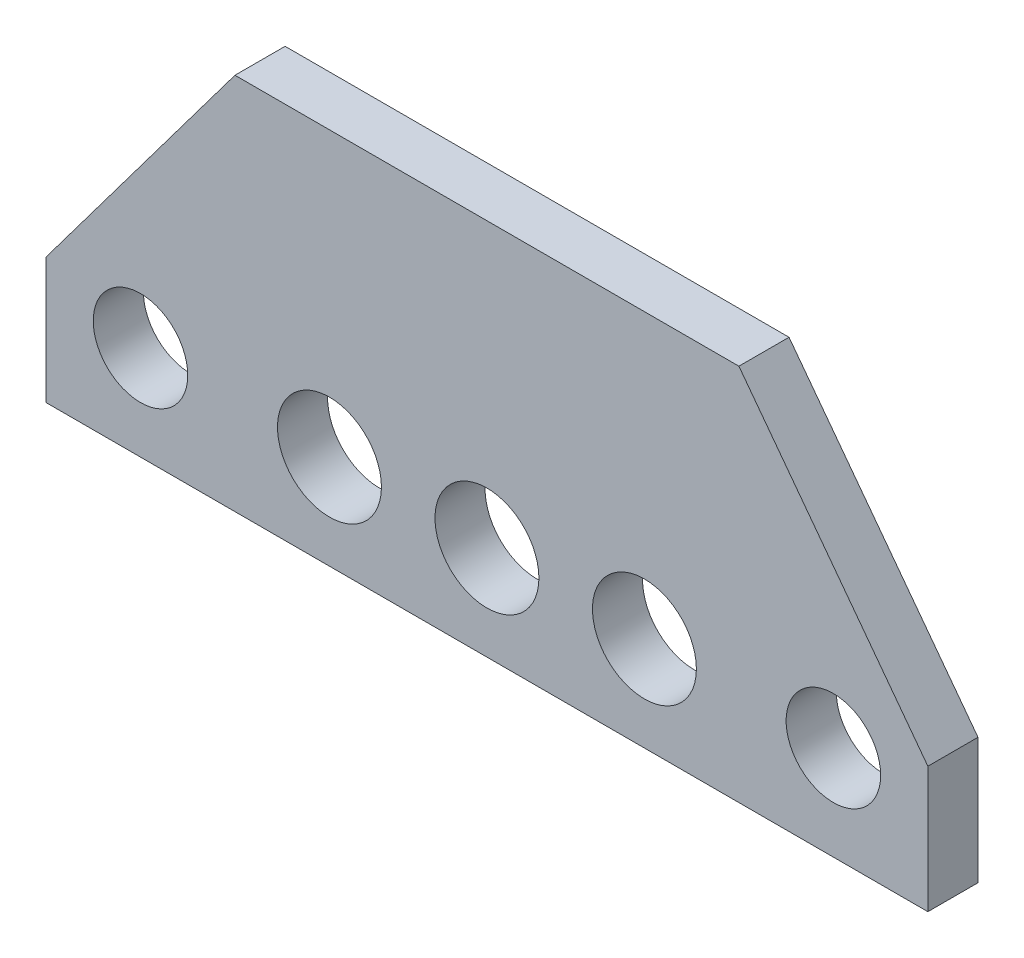
ISO-10303-21;
HEADER;
FILE_DESCRIPTION(('STEP AP214'),'2;1');
FILE_NAME('part.step','',(''),(''),'','','');
FILE_SCHEMA(('AUTOMOTIVE_DESIGN { 1 0 10303 214 1 1 1 1 }'));
ENDSEC;
DATA;
#1=APPLICATION_CONTEXT('core data for automotive mechanical design processes');
#2=APPLICATION_PROTOCOL_DEFINITION('international standard','automotive_design',2000,#1);
#3=PRODUCT_CONTEXT('',#1,'mechanical');
#4=PRODUCT('Part','Part','',(#3));
#5=PRODUCT_RELATED_PRODUCT_CATEGORY('part','',(#4));
#6=PRODUCT_DEFINITION_FORMATION('','',#4);
#7=PRODUCT_DEFINITION_CONTEXT('part definition',#1,'design');
#8=PRODUCT_DEFINITION('design','',#6,#7);
#9=PRODUCT_DEFINITION_SHAPE('','',#8);
#10=(LENGTH_UNIT() NAMED_UNIT(*) SI_UNIT(.MILLI.,.METRE.));
#11=(NAMED_UNIT(*) PLANE_ANGLE_UNIT() SI_UNIT($,.RADIAN.));
#12=(NAMED_UNIT(*) SI_UNIT($,.STERADIAN.) SOLID_ANGLE_UNIT());
#13=UNCERTAINTY_MEASURE_WITH_UNIT(LENGTH_MEASURE(1.E-05),#10,'distance_accuracy_value','');
#14=(GEOMETRIC_REPRESENTATION_CONTEXT(3) GLOBAL_UNCERTAINTY_ASSIGNED_CONTEXT((#13)) GLOBAL_UNIT_ASSIGNED_CONTEXT((#10,
#11,#12)) REPRESENTATION_CONTEXT('',''));
#15=CARTESIAN_POINT('',(0.,0.,0.));
#16=DIRECTION('',(0.,0.,1.));
#17=DIRECTION('',(1.,0.,0.));
#18=AXIS2_PLACEMENT_3D('',#15,#16,#17);
#19=CARTESIAN_POINT('',(0.,0.,-1.59143954));
#20=DIRECTION('',(0.,1.,0.));
#21=DIRECTION('',(1.,0.,0.));
#22=AXIS2_PLACEMENT_3D('',#19,#20,#21);
#23=PLANE('',#22);
#24=DIRECTION('',(1.,0.,0.));
#25=VECTOR('',#24,1.);
#26=CARTESIAN_POINT('',(0.,0.,-1.59143954));
#27=LINE('',#26,#25);
#28=CARTESIAN_POINT('',(0.,0.,-1.59143954));
#29=VERTEX_POINT('',#28);
#30=CARTESIAN_POINT('',(28.,0.,-1.59143954));
#31=VERTEX_POINT('',#30);
#32=EDGE_CURVE('E12',#29,#31,#27,.T.);
#33=ORIENTED_EDGE('',*,*,#32,.T.);
#34=DIRECTION('',(0.,0.,1.));
#35=VECTOR('',#34,1.);
#36=CARTESIAN_POINT('',(28.,0.,-1.59143954));
#37=LINE('',#36,#35);
#38=CARTESIAN_POINT('',(28.,0.,0.));
#39=VERTEX_POINT('',#38);
#40=EDGE_CURVE('E26',#31,#39,#37,.T.);
#41=ORIENTED_EDGE('',*,*,#40,.T.);
#42=DIRECTION('',(1.,0.,0.));
#43=VECTOR('',#42,1.);
#44=CARTESIAN_POINT('',(0.,0.,0.));
#45=LINE('',#44,#43);
#46=CARTESIAN_POINT('',(0.,0.,0.));
#47=VERTEX_POINT('',#46);
#48=EDGE_CURVE('E169',#47,#39,#45,.T.);
#49=ORIENTED_EDGE('',*,*,#48,.F.);
#50=DIRECTION('',(0.,0.,1.));
#51=VECTOR('',#50,1.);
#52=CARTESIAN_POINT('',(0.,0.,-1.59143954));
#53=LINE('',#52,#51);
#54=EDGE_CURVE('E38',#29,#47,#53,.T.);
#55=ORIENTED_EDGE('',*,*,#54,.F.);
#56=EDGE_LOOP('',(#33,#41,#49,#55));
#57=FACE_BOUND('',#56,.T.);
#58=ADVANCED_FACE('F19',(#57),#23,.F.);
#59=CARTESIAN_POINT('',(28.,0.,-1.59143954));
#60=DIRECTION('',(-1.,0.,0.));
#61=DIRECTION('',(0.,1.,0.));
#62=AXIS2_PLACEMENT_3D('',#59,#60,#61);
#63=PLANE('',#62);
#64=DIRECTION('',(0.,1.,0.));
#65=VECTOR('',#64,1.);
#66=CARTESIAN_POINT('',(28.,0.,-1.59143954));
#67=LINE('',#66,#65);
#68=CARTESIAN_POINT('',(28.,4.,-1.59143954));
#69=VERTEX_POINT('',#68);
#70=EDGE_CURVE('E161',#31,#69,#67,.T.);
#71=ORIENTED_EDGE('',*,*,#70,.T.);
#72=DIRECTION('',(0.,0.,1.));
#73=VECTOR('',#72,1.);
#74=CARTESIAN_POINT('',(28.,4.,-1.59143954));
#75=LINE('',#74,#73);
#76=CARTESIAN_POINT('',(28.,4.,0.));
#77=VERTEX_POINT('',#76);
#78=EDGE_CURVE('E166',#69,#77,#75,.T.);
#79=ORIENTED_EDGE('',*,*,#78,.T.);
#80=DIRECTION('',(0.,1.,0.));
#81=VECTOR('',#80,1.);
#82=CARTESIAN_POINT('',(28.,0.,0.));
#83=LINE('',#82,#81);
#84=EDGE_CURVE('E172',#39,#77,#83,.T.);
#85=ORIENTED_EDGE('',*,*,#84,.F.);
#86=ORIENTED_EDGE('',*,*,#40,.F.);
#87=EDGE_LOOP('',(#71,#79,#85,#86));
#88=FACE_BOUND('',#87,.T.);
#89=ADVANCED_FACE('F173',(#88),#63,.F.);
#90=CARTESIAN_POINT('',(28.,4.,-1.59143954));
#91=DIRECTION('',(-0.8,-0.6,0.));
#92=DIRECTION('',(-0.6,0.8,0.));
#93=AXIS2_PLACEMENT_3D('',#90,#91,#92);
#94=PLANE('',#93);
#95=DIRECTION('',(-0.6,0.8,0.));
#96=VECTOR('',#95,1.);
#97=CARTESIAN_POINT('',(28.,4.,-1.59143954));
#98=LINE('',#97,#96);
#99=CARTESIAN_POINT('',(22.,12.,-1.59143954));
#100=VERTEX_POINT('',#99);
#101=EDGE_CURVE('E176',#69,#100,#98,.T.);
#102=ORIENTED_EDGE('',*,*,#101,.T.);
#103=DIRECTION('',(0.,0.,1.));
#104=VECTOR('',#103,1.);
#105=CARTESIAN_POINT('',(22.,12.,-1.59143954));
#106=LINE('',#105,#104);
#107=CARTESIAN_POINT('',(22.,12.,0.));
#108=VERTEX_POINT('',#107);
#109=EDGE_CURVE('E178',#100,#108,#106,.T.);
#110=ORIENTED_EDGE('',*,*,#109,.T.);
#111=DIRECTION('',(-0.6,0.8,0.));
#112=VECTOR('',#111,1.);
#113=CARTESIAN_POINT('',(28.,4.,0.));
#114=LINE('',#113,#112);
#115=EDGE_CURVE('E183',#77,#108,#114,.T.);
#116=ORIENTED_EDGE('',*,*,#115,.F.);
#117=ORIENTED_EDGE('',*,*,#78,.F.);
#118=EDGE_LOOP('',(#102,#110,#116,#117));
#119=FACE_BOUND('',#118,.T.);
#120=ADVANCED_FACE('F199',(#119),#94,.F.);
#121=CARTESIAN_POINT('',(22.,12.,-1.59143954));
#122=DIRECTION('',(0.,-1.,0.));
#123=DIRECTION('',(-1.,0.,0.));
#124=AXIS2_PLACEMENT_3D('',#121,#122,#123);
#125=PLANE('',#124);
#126=DIRECTION('',(-1.,0.,0.));
#127=VECTOR('',#126,1.);
#128=CARTESIAN_POINT('',(22.,12.,-1.59143954));
#129=LINE('',#128,#127);
#130=CARTESIAN_POINT('',(6.,12.,-1.59143954));
#131=VERTEX_POINT('',#130);
#132=EDGE_CURVE('E185',#100,#131,#129,.T.);
#133=ORIENTED_EDGE('',*,*,#132,.T.);
#134=DIRECTION('',(0.,0.,1.));
#135=VECTOR('',#134,1.);
#136=CARTESIAN_POINT('',(6.,12.,-1.59143954));
#137=LINE('',#136,#135);
#138=CARTESIAN_POINT('',(6.,12.,0.));
#139=VERTEX_POINT('',#138);
#140=EDGE_CURVE('E187',#131,#139,#137,.T.);
#141=ORIENTED_EDGE('',*,*,#140,.T.);
#142=DIRECTION('',(-1.,0.,0.));
#143=VECTOR('',#142,1.);
#144=CARTESIAN_POINT('',(22.,12.,0.));
#145=LINE('',#144,#143);
#146=EDGE_CURVE('E154',#108,#139,#145,.T.);
#147=ORIENTED_EDGE('',*,*,#146,.F.);
#148=ORIENTED_EDGE('',*,*,#109,.F.);
#149=EDGE_LOOP('',(#133,#141,#147,#148));
#150=FACE_BOUND('',#149,.T.);
#151=ADVANCED_FACE('F194',(#150),#125,.F.);
#152=CARTESIAN_POINT('',(6.,12.,-1.59143954));
#153=DIRECTION('',(0.8,-0.6,0.));
#154=DIRECTION('',(-0.6,-0.8,0.));
#155=AXIS2_PLACEMENT_3D('',#152,#153,#154);
#156=PLANE('',#155);
#157=DIRECTION('',(-0.6,-0.8,0.));
#158=VECTOR('',#157,1.);
#159=CARTESIAN_POINT('',(6.,12.,-1.59143954));
#160=LINE('',#159,#158);
#161=CARTESIAN_POINT('',(0.,4.,-1.59143954));
#162=VERTEX_POINT('',#161);
#163=EDGE_CURVE('E149',#131,#162,#160,.T.);
#164=ORIENTED_EDGE('',*,*,#163,.T.);
#165=DIRECTION('',(0.,0.,1.));
#166=VECTOR('',#165,1.);
#167=CARTESIAN_POINT('',(0.,4.,-1.59143954));
#168=LINE('',#167,#166);
#169=CARTESIAN_POINT('',(0.,4.,0.));
#170=VERTEX_POINT('',#169);
#171=EDGE_CURVE('E147',#162,#170,#168,.T.);
#172=ORIENTED_EDGE('',*,*,#171,.T.);
#173=DIRECTION('',(-0.6,-0.8,0.));
#174=VECTOR('',#173,1.);
#175=CARTESIAN_POINT('',(6.,12.,0.));
#176=LINE('',#175,#174);
#177=EDGE_CURVE('E145',#139,#170,#176,.T.);
#178=ORIENTED_EDGE('',*,*,#177,.F.);
#179=ORIENTED_EDGE('',*,*,#140,.F.);
#180=EDGE_LOOP('',(#164,#172,#178,#179));
#181=FACE_BOUND('',#180,.T.);
#182=ADVANCED_FACE('F204',(#181),#156,.F.);
#183=CARTESIAN_POINT('',(0.,4.,-1.59143954));
#184=DIRECTION('',(1.,0.,0.));
#185=DIRECTION('',(0.,-1.,0.));
#186=AXIS2_PLACEMENT_3D('',#183,#184,#185);
#187=PLANE('',#186);
#188=DIRECTION('',(0.,-1.,0.));
#189=VECTOR('',#188,1.);
#190=CARTESIAN_POINT('',(0.,4.,-1.59143954));
#191=LINE('',#190,#189);
#192=EDGE_CURVE('E142',#162,#29,#191,.T.);
#193=ORIENTED_EDGE('',*,*,#192,.T.);
#194=ORIENTED_EDGE('',*,*,#54,.T.);
#195=DIRECTION('',(0.,-1.,0.));
#196=VECTOR('',#195,1.);
#197=CARTESIAN_POINT('',(0.,4.,0.));
#198=LINE('',#197,#196);
#199=EDGE_CURVE('E139',#170,#47,#198,.T.);
#200=ORIENTED_EDGE('',*,*,#199,.F.);
#201=ORIENTED_EDGE('',*,*,#171,.F.);
#202=EDGE_LOOP('',(#193,#194,#200,#201));
#203=FACE_BOUND('',#202,.T.);
#204=ADVANCED_FACE('F207',(#203),#187,.F.);
#205=CARTESIAN_POINT('',(8.99999978,2.99999908,-1.59143954));
#206=DIRECTION('',(0.,0.,-1.));
#207=DIRECTION('',(1.,0.,0.));
#208=AXIS2_PLACEMENT_3D('',#205,#206,#207);
#209=CYLINDRICAL_SURFACE('',#208,1.64999924);
#210=DIRECTION('',(0.,0.,1.));
#211=VECTOR('',#210,1.);
#212=CARTESIAN_POINT('',(10.64999902,2.99999908,-1.59143954));
#213=LINE('',#212,#211);
#214=CARTESIAN_POINT('',(10.64999902,2.99999908,-1.59143954));
#215=VERTEX_POINT('',#214);
#216=CARTESIAN_POINT('',(10.64999902,2.99999908,0.));
#217=VERTEX_POINT('',#216);
#218=EDGE_CURVE('E137',#215,#217,#213,.T.);
#219=ORIENTED_EDGE('',*,*,#218,.T.);
#220=CARTESIAN_POINT('',(8.99999978,2.99999908,0.));
#221=DIRECTION('',(0.,0.,1.));
#222=DIRECTION('',(1.,0.,0.));
#223=AXIS2_PLACEMENT_3D('',#220,#221,#222);
#224=CIRCLE('',#223,1.64999924);
#225=EDGE_CURVE('E134',#217,#217,#224,.T.);
#226=ORIENTED_EDGE('',*,*,#225,.T.);
#227=ORIENTED_EDGE('',*,*,#218,.F.);
#228=CARTESIAN_POINT('',(8.99999978,2.99999908,-1.59143954));
#229=DIRECTION('',(0.,0.,1.));
#230=DIRECTION('',(1.,0.,0.));
#231=AXIS2_PLACEMENT_3D('',#228,#229,#230);
#232=CIRCLE('',#231,1.64999924);
#233=EDGE_CURVE('E132',#215,#215,#232,.T.);
#234=ORIENTED_EDGE('',*,*,#233,.F.);
#235=EDGE_LOOP('',(#219,#226,#227,#234));
#236=FACE_BOUND('',#235,.T.);
#237=ADVANCED_FACE('F209',(#236),#209,.F.);
#238=CARTESIAN_POINT('',(2.99999908,2.99999908,-1.59143954));
#239=DIRECTION('',(0.,0.,-1.));
#240=DIRECTION('',(1.,0.,0.));
#241=AXIS2_PLACEMENT_3D('',#238,#239,#240);
#242=CYLINDRICAL_SURFACE('',#241,1.49999954);
#243=DIRECTION('',(0.,0.,1.));
#244=VECTOR('',#243,1.);
#245=CARTESIAN_POINT('',(4.49999862,2.99999908,-1.59143954));
#246=LINE('',#245,#244);
#247=CARTESIAN_POINT('',(4.49999862,2.99999908,-1.59143954));
#248=VERTEX_POINT('',#247);
#249=CARTESIAN_POINT('',(4.49999862,2.99999908,0.));
#250=VERTEX_POINT('',#249);
#251=EDGE_CURVE('E130',#248,#250,#246,.T.);
#252=ORIENTED_EDGE('',*,*,#251,.T.);
#253=CARTESIAN_POINT('',(2.99999908,2.99999908,0.));
#254=DIRECTION('',(0.,0.,1.));
#255=DIRECTION('',(1.,0.,0.));
#256=AXIS2_PLACEMENT_3D('',#253,#254,#255);
#257=CIRCLE('',#256,1.49999954);
#258=EDGE_CURVE('E127',#250,#250,#257,.T.);
#259=ORIENTED_EDGE('',*,*,#258,.T.);
#260=ORIENTED_EDGE('',*,*,#251,.F.);
#261=CARTESIAN_POINT('',(2.99999908,2.99999908,-1.59143954));
#262=DIRECTION('',(0.,0.,1.));
#263=DIRECTION('',(1.,0.,0.));
#264=AXIS2_PLACEMENT_3D('',#261,#262,#263);
#265=CIRCLE('',#264,1.49999954);
#266=EDGE_CURVE('E125',#248,#248,#265,.T.);
#267=ORIENTED_EDGE('',*,*,#266,.F.);
#268=EDGE_LOOP('',(#252,#259,#260,#267));
#269=FACE_BOUND('',#268,.T.);
#270=ADVANCED_FACE('F216',(#269),#242,.F.);
#271=CARTESIAN_POINT('',(13.99999994,2.99999908,-1.59143954));
#272=DIRECTION('',(0.,0.,-1.));
#273=DIRECTION('',(1.,0.,0.));
#274=AXIS2_PLACEMENT_3D('',#271,#272,#273);
#275=CYLINDRICAL_SURFACE('',#274,1.64999924);
#276=DIRECTION('',(0.,0.,1.));
#277=VECTOR('',#276,1.);
#278=CARTESIAN_POINT('',(15.64999918,2.99999908,-1.59143954));
#279=LINE('',#278,#277);
#280=CARTESIAN_POINT('',(15.64999918,2.99999908,-1.59143954));
#281=VERTEX_POINT('',#280);
#282=CARTESIAN_POINT('',(15.64999918,2.99999908,0.));
#283=VERTEX_POINT('',#282);
#284=EDGE_CURVE('E123',#281,#283,#279,.T.);
#285=ORIENTED_EDGE('',*,*,#284,.T.);
#286=CARTESIAN_POINT('',(13.99999994,2.99999908,0.));
#287=DIRECTION('',(0.,0.,1.));
#288=DIRECTION('',(1.,0.,0.));
#289=AXIS2_PLACEMENT_3D('',#286,#287,#288);
#290=CIRCLE('',#289,1.64999924);
#291=EDGE_CURVE('E120',#283,#283,#290,.T.);
#292=ORIENTED_EDGE('',*,*,#291,.T.);
#293=ORIENTED_EDGE('',*,*,#284,.F.);
#294=CARTESIAN_POINT('',(13.99999994,2.99999908,-1.59143954));
#295=DIRECTION('',(0.,0.,1.));
#296=DIRECTION('',(1.,0.,0.));
#297=AXIS2_PLACEMENT_3D('',#294,#295,#296);
#298=CIRCLE('',#297,1.64999924);
#299=EDGE_CURVE('E118',#281,#281,#298,.T.);
#300=ORIENTED_EDGE('',*,*,#299,.F.);
#301=EDGE_LOOP('',(#285,#292,#293,#300));
#302=FACE_BOUND('',#301,.T.);
#303=ADVANCED_FACE('F262',(#302),#275,.F.);
#304=CARTESIAN_POINT('',(19.0000001,2.99999908,-1.59143954));
#305=DIRECTION('',(0.,0.,-1.));
#306=DIRECTION('',(1.,0.,0.));
#307=AXIS2_PLACEMENT_3D('',#304,#305,#306);
#308=CYLINDRICAL_SURFACE('',#307,1.64999924);
#309=DIRECTION('',(0.,0.,1.));
#310=VECTOR('',#309,1.);
#311=CARTESIAN_POINT('',(20.64999934,2.99999908,-1.59143954));
#312=LINE('',#311,#310);
#313=CARTESIAN_POINT('',(20.64999934,2.99999908,-1.59143954));
#314=VERTEX_POINT('',#313);
#315=CARTESIAN_POINT('',(20.64999934,2.99999908,0.));
#316=VERTEX_POINT('',#315);
#317=EDGE_CURVE('E116',#314,#316,#312,.T.);
#318=ORIENTED_EDGE('',*,*,#317,.T.);
#319=CARTESIAN_POINT('',(19.0000001,2.99999908,0.));
#320=DIRECTION('',(0.,0.,1.));
#321=DIRECTION('',(1.,0.,0.));
#322=AXIS2_PLACEMENT_3D('',#319,#320,#321);
#323=CIRCLE('',#322,1.64999924);
#324=EDGE_CURVE('E113',#316,#316,#323,.T.);
#325=ORIENTED_EDGE('',*,*,#324,.T.);
#326=ORIENTED_EDGE('',*,*,#317,.F.);
#327=CARTESIAN_POINT('',(19.0000001,2.99999908,-1.59143954));
#328=DIRECTION('',(0.,0.,1.));
#329=DIRECTION('',(1.,0.,0.));
#330=AXIS2_PLACEMENT_3D('',#327,#328,#329);
#331=CIRCLE('',#330,1.64999924);
#332=EDGE_CURVE('E111',#314,#314,#331,.T.);
#333=ORIENTED_EDGE('',*,*,#332,.F.);
#334=EDGE_LOOP('',(#318,#325,#326,#333));
#335=FACE_BOUND('',#334,.T.);
#336=ADVANCED_FACE('F272',(#335),#308,.F.);
#337=CARTESIAN_POINT('',(25.0000008,2.99999908,-1.59143954));
#338=DIRECTION('',(0.,0.,-1.));
#339=DIRECTION('',(1.,0.,0.));
#340=AXIS2_PLACEMENT_3D('',#337,#338,#339);
#341=CYLINDRICAL_SURFACE('',#340,1.49999954);
#342=DIRECTION('',(0.,0.,1.));
#343=VECTOR('',#342,1.);
#344=CARTESIAN_POINT('',(26.50000034,2.99999908,-1.59143954));
#345=LINE('',#344,#343);
#346=CARTESIAN_POINT('',(26.50000034,2.99999908,-1.59143954));
#347=VERTEX_POINT('',#346);
#348=CARTESIAN_POINT('',(26.50000034,2.99999908,0.));
#349=VERTEX_POINT('',#348);
#350=EDGE_CURVE('E107',#347,#349,#345,.T.);
#351=ORIENTED_EDGE('',*,*,#350,.T.);
#352=CARTESIAN_POINT('',(25.0000008,2.99999908,0.));
#353=DIRECTION('',(0.,0.,1.));
#354=DIRECTION('',(1.,0.,0.));
#355=AXIS2_PLACEMENT_3D('',#352,#353,#354);
#356=CIRCLE('',#355,1.49999954);
#357=EDGE_CURVE('E104',#349,#349,#356,.T.);
#358=ORIENTED_EDGE('',*,*,#357,.T.);
#359=ORIENTED_EDGE('',*,*,#350,.F.);
#360=CARTESIAN_POINT('',(25.0000008,2.99999908,-1.59143954));
#361=DIRECTION('',(0.,0.,1.));
#362=DIRECTION('',(1.,0.,0.));
#363=AXIS2_PLACEMENT_3D('',#360,#361,#362);
#364=CIRCLE('',#363,1.49999954);
#365=EDGE_CURVE('E100',#347,#347,#364,.T.);
#366=ORIENTED_EDGE('',*,*,#365,.F.);
#367=EDGE_LOOP('',(#351,#358,#359,#366));
#368=FACE_BOUND('',#367,.T.);
#369=ADVANCED_FACE('F282',(#368),#341,.F.);
#370=CARTESIAN_POINT('',(0.,0.,-1.59143954));
#371=DIRECTION('',(0.,0.,-1.));
#372=DIRECTION('',(-1.,0.,0.));
#373=AXIS2_PLACEMENT_3D('',#370,#371,#372);
#374=PLANE('',#373);
#375=ORIENTED_EDGE('',*,*,#192,.F.);
#376=ORIENTED_EDGE('',*,*,#163,.F.);
#377=ORIENTED_EDGE('',*,*,#132,.F.);
#378=ORIENTED_EDGE('',*,*,#101,.F.);
#379=ORIENTED_EDGE('',*,*,#70,.F.);
#380=ORIENTED_EDGE('',*,*,#32,.F.);
#381=EDGE_LOOP('',(#375,#376,#377,#378,#379,#380));
#382=FACE_BOUND('',#381,.T.);
#383=ORIENTED_EDGE('',*,*,#233,.T.);
#384=EDGE_LOOP('',(#383));
#385=FACE_BOUND('',#384,.T.);
#386=ORIENTED_EDGE('',*,*,#266,.T.);
#387=EDGE_LOOP('',(#386));
#388=FACE_BOUND('',#387,.T.);
#389=ORIENTED_EDGE('',*,*,#299,.T.);
#390=EDGE_LOOP('',(#389));
#391=FACE_BOUND('',#390,.T.);
#392=ORIENTED_EDGE('',*,*,#332,.T.);
#393=EDGE_LOOP('',(#392));
#394=FACE_BOUND('',#393,.T.);
#395=ORIENTED_EDGE('',*,*,#365,.T.);
#396=EDGE_LOOP('',(#395));
#397=FACE_BOUND('',#396,.T.);
#398=ADVANCED_FACE('F101',(#382,#385,#388,#391,#394,#397),#374,.T.);
#399=CARTESIAN_POINT('',(0.,0.,0.));
#400=DIRECTION('',(0.,0.,-1.));
#401=DIRECTION('',(-1.,0.,0.));
#402=AXIS2_PLACEMENT_3D('',#399,#400,#401);
#403=PLANE('',#402);
#404=ORIENTED_EDGE('',*,*,#48,.T.);
#405=ORIENTED_EDGE('',*,*,#84,.T.);
#406=ORIENTED_EDGE('',*,*,#115,.T.);
#407=ORIENTED_EDGE('',*,*,#146,.T.);
#408=ORIENTED_EDGE('',*,*,#177,.T.);
#409=ORIENTED_EDGE('',*,*,#199,.T.);
#410=EDGE_LOOP('',(#404,#405,#406,#407,#408,#409));
#411=FACE_BOUND('',#410,.T.);
#412=ORIENTED_EDGE('',*,*,#225,.F.);
#413=EDGE_LOOP('',(#412));
#414=FACE_BOUND('',#413,.T.);
#415=ORIENTED_EDGE('',*,*,#258,.F.);
#416=EDGE_LOOP('',(#415));
#417=FACE_BOUND('',#416,.T.);
#418=ORIENTED_EDGE('',*,*,#291,.F.);
#419=EDGE_LOOP('',(#418));
#420=FACE_BOUND('',#419,.T.);
#421=ORIENTED_EDGE('',*,*,#324,.F.);
#422=EDGE_LOOP('',(#421));
#423=FACE_BOUND('',#422,.T.);
#424=ORIENTED_EDGE('',*,*,#357,.F.);
#425=EDGE_LOOP('',(#424));
#426=FACE_BOUND('',#425,.T.);
#427=ADVANCED_FACE('F192',(#411,#414,#417,#420,#423,#426),#403,.F.);
#428=CLOSED_SHELL('',(#58,#89,#120,#151,#182,#204,#237,#270,#303,#336,#369,#398,#427));
#429=MANIFOLD_SOLID_BREP('B1',#428);
#430=ADVANCED_BREP_SHAPE_REPRESENTATION('',(#18,#429),#14);
#431=SHAPE_DEFINITION_REPRESENTATION(#9,#430);
ENDSEC;
END-ISO-10303-21;
